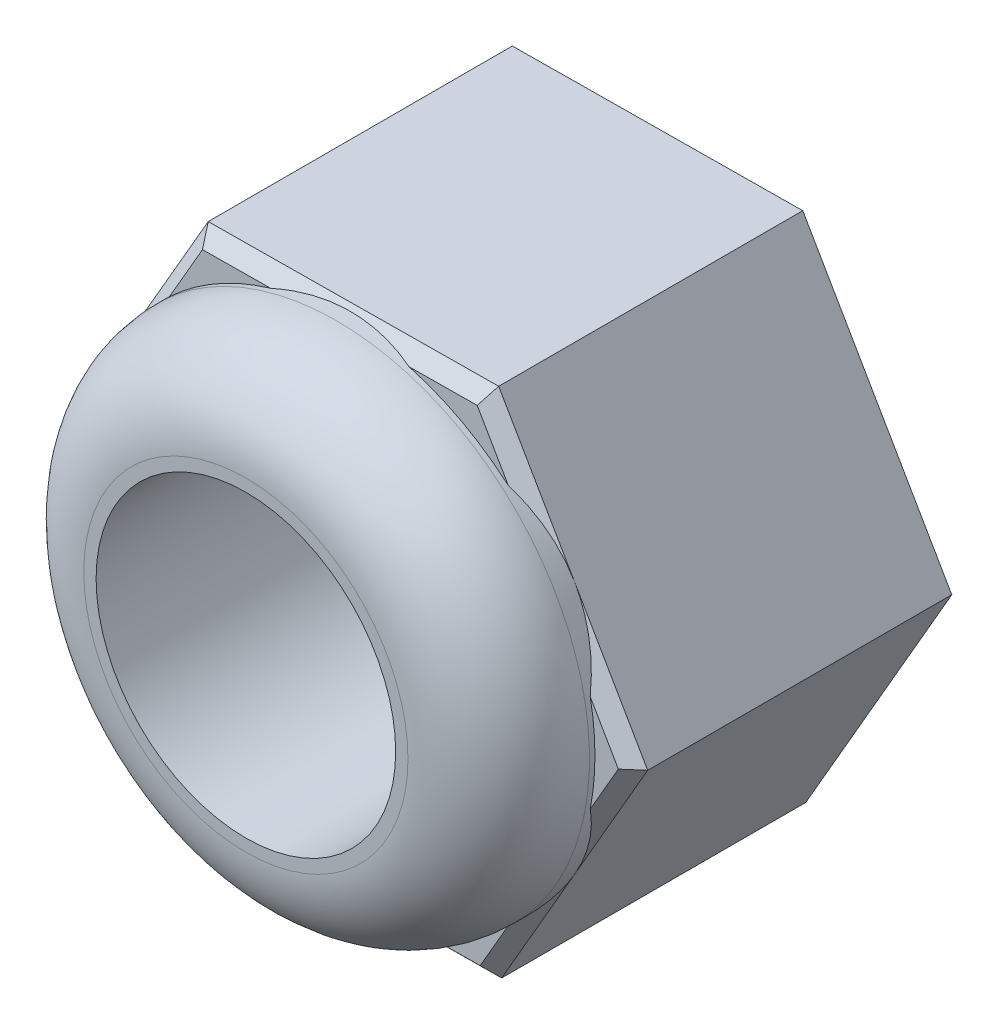
ISO-10303-21;
HEADER;
FILE_DESCRIPTION(('STEP AP214'),'2;1');
FILE_NAME('part.step','',(''),(''),'','','');
FILE_SCHEMA(('AUTOMOTIVE_DESIGN { 1 0 10303 214 1 1 1 1 }'));
ENDSEC;
DATA;
#1=APPLICATION_CONTEXT('core data for automotive mechanical design processes');
#2=APPLICATION_PROTOCOL_DEFINITION('international standard','automotive_design',2000,#1);
#3=PRODUCT_CONTEXT('',#1,'mechanical');
#4=PRODUCT('Part','Part','',(#3));
#5=PRODUCT_RELATED_PRODUCT_CATEGORY('part','',(#4));
#6=PRODUCT_DEFINITION_FORMATION('','',#4);
#7=PRODUCT_DEFINITION_CONTEXT('part definition',#1,'design');
#8=PRODUCT_DEFINITION('design','',#6,#7);
#9=PRODUCT_DEFINITION_SHAPE('','',#8);
#10=(LENGTH_UNIT() NAMED_UNIT(*) SI_UNIT(.MILLI.,.METRE.));
#11=(NAMED_UNIT(*) PLANE_ANGLE_UNIT() SI_UNIT($,.RADIAN.));
#12=(NAMED_UNIT(*) SI_UNIT($,.STERADIAN.) SOLID_ANGLE_UNIT());
#13=UNCERTAINTY_MEASURE_WITH_UNIT(LENGTH_MEASURE(1.E-05),#10,'distance_accuracy_value','');
#14=(GEOMETRIC_REPRESENTATION_CONTEXT(3) GLOBAL_UNCERTAINTY_ASSIGNED_CONTEXT((#13)) GLOBAL_UNIT_ASSIGNED_CONTEXT((#10,
#11,#12)) REPRESENTATION_CONTEXT('',''));
#15=CARTESIAN_POINT('',(0.,0.,0.));
#16=DIRECTION('',(0.,0.,1.));
#17=DIRECTION('',(1.,0.,0.));
#18=AXIS2_PLACEMENT_3D('',#15,#16,#17);
#19=CARTESIAN_POINT('',(12.8092435570243,13.3167483371117,8.89));
#20=DIRECTION('',(0.,0.,1.));
#21=DIRECTION('',(1.,0.,0.));
#22=AXIS2_PLACEMENT_3D('',#19,#20,#21);
#23=PLANE('',#22);
#24=CARTESIAN_POINT('',(12.8520866791741,13.2922264839932,8.89));
#25=DIRECTION('',(0.,0.,1.));
#26=DIRECTION('',(1.,0.,0.));
#27=AXIS2_PLACEMENT_3D('',#24,#25,#26);
#28=CIRCLE('',#27,7.07496029175945);
#29=CARTESIAN_POINT('',(5.96017341320023,11.6932910055368,8.89));
#30=VERTEX_POINT('',#29);
#31=CARTESIAN_POINT('',(5.96017341320023,14.8911619624497,8.89));
#32=VERTEX_POINT('',#31);
#33=EDGE_CURVE('E124',#30,#32,#28,.F.);
#34=ORIENTED_EDGE('',*,*,#33,.T.);
#35=DIRECTION('',(0.500000000000002,0.866025403784437,0.));
#36=VECTOR('',#35,1.);
#37=CARTESIAN_POINT('',(5.03702758429654,13.2922264839932,8.89));
#38=LINE('',#37,#36);
#39=CARTESIAN_POINT('',(5.03702758429655,13.2922264839932,8.88999999999999));
#40=VERTEX_POINT('',#39);
#41=EDGE_CURVE('E126',#40,#32,#38,.T.);
#42=ORIENTED_EDGE('',*,*,#41,.F.);
#43=DIRECTION('',(-0.500000000000003,0.866025403784437,0.));
#44=VECTOR('',#43,1.);
#45=CARTESIAN_POINT('',(5.9601734132002,11.6932910055368,8.89));
#46=LINE('',#45,#44);
#47=EDGE_CURVE('E128',#30,#40,#46,.T.);
#48=ORIENTED_EDGE('',*,*,#47,.F.);
#49=EDGE_LOOP('',(#34,#42,#48));
#50=FACE_BOUND('',#49,.T.);
#51=ADVANCED_FACE('F17',(#50),#23,.T.);
#52=CARTESIAN_POINT('',(12.8092435570243,13.3167483371117,8.89));
#53=DIRECTION('',(0.,0.,1.));
#54=DIRECTION('',(1.,0.,0.));
#55=AXIS2_PLACEMENT_3D('',#52,#53,#54);
#56=PLANE('',#55);
#57=CARTESIAN_POINT('',(12.8520866791741,13.2922264839932,8.89));
#58=DIRECTION('',(0.,0.,1.));
#59=DIRECTION('',(1.,0.,0.));
#60=AXIS2_PLACEMENT_3D('',#57,#58,#59);
#61=CIRCLE('',#60,7.07496029175945);
#62=CARTESIAN_POINT('',(8.02141130283164,8.1231222542091,8.89));
#63=VERTEX_POINT('',#62);
#64=CARTESIAN_POINT('',(10.7322456959346,6.54231260782032,8.89));
#65=VERTEX_POINT('',#64);
#66=EDGE_CURVE('E176',#63,#65,#61,.T.);
#67=ORIENTED_EDGE('',*,*,#66,.F.);
#68=DIRECTION('',(-0.500000000000001,0.866025403784438,0.));
#69=VECTOR('',#68,1.);
#70=CARTESIAN_POINT('',(8.94340854528067,6.52617618584898,8.89));
#71=LINE('',#70,#69);
#72=CARTESIAN_POINT('',(8.94340854528066,6.52617618584898,8.89));
#73=VERTEX_POINT('',#72);
#74=EDGE_CURVE('E341',#73,#63,#71,.T.);
#75=ORIENTED_EDGE('',*,*,#74,.F.);
#76=DIRECTION('',(-0.999959316681197,-0.00902025401375281,0.));
#77=VECTOR('',#76,1.);
#78=CARTESIAN_POINT('',(10.7322456959346,6.54231260782032,8.89));
#79=LINE('',#78,#77);
#80=EDGE_CURVE('E321',#65,#73,#79,.T.);
#81=ORIENTED_EDGE('',*,*,#80,.F.);
#82=EDGE_LOOP('',(#67,#75,#81));
#83=FACE_BOUND('',#82,.T.);
#84=ADVANCED_FACE('F606',(#83),#56,.T.);
#85=CARTESIAN_POINT('',(12.8092435570243,13.3167483371117,8.89));
#86=DIRECTION('',(0.,0.,1.));
#87=DIRECTION('',(1.,0.,0.));
#88=AXIS2_PLACEMENT_3D('',#85,#86,#87);
#89=PLANE('',#88);
#90=CARTESIAN_POINT('',(12.8520866791741,13.2922264839932,8.89));
#91=DIRECTION('',(0.,0.,1.));
#92=DIRECTION('',(1.,0.,0.));
#93=AXIS2_PLACEMENT_3D('',#90,#91,#92);
#94=CIRCLE('',#93,7.07496029175945);
#95=CARTESIAN_POINT('',(15.0933496221487,6.58165247349143,8.89));
#96=VERTEX_POINT('',#95);
#97=CARTESIAN_POINT('',(17.504023442271,7.96169672775696,8.89));
#98=VERTEX_POINT('',#97);
#99=EDGE_CURVE('E171',#96,#98,#94,.T.);
#100=ORIENTED_EDGE('',*,*,#99,.F.);
#101=DIRECTION('',(-0.999959316681198,-0.00902025401375211,0.));
#102=VECTOR('',#101,1.);
#103=CARTESIAN_POINT('',(16.7157038353579,6.59628711598069,8.89));
#104=LINE('',#103,#102);
#105=CARTESIAN_POINT('',(16.7157038353579,6.59628711598069,8.88999999999999));
#106=VERTEX_POINT('',#105);
#107=EDGE_CURVE('E323',#106,#96,#104,.T.);
#108=ORIENTED_EDGE('',*,*,#107,.F.);
#109=DIRECTION('',(-0.499999999999995,-0.866025403784442,0.));
#110=VECTOR('',#109,1.);
#111=CARTESIAN_POINT('',(17.504023442271,7.96169672775699,8.89));
#112=LINE('',#111,#110);
#113=EDGE_CURVE('E279',#98,#106,#112,.T.);
#114=ORIENTED_EDGE('',*,*,#113,.F.);
#115=EDGE_LOOP('',(#100,#108,#114));
#116=FACE_BOUND('',#115,.T.);
#117=ADVANCED_FACE('F597',(#116),#89,.T.);
#118=CARTESIAN_POINT('',(12.8092435570243,13.3167483371117,8.89));
#119=DIRECTION('',(0.,0.,1.));
#120=DIRECTION('',(1.,0.,0.));
#121=AXIS2_PLACEMENT_3D('',#118,#119,#120);
#122=PLANE('',#121);
#123=CARTESIAN_POINT('',(12.8520866791741,13.2922264839932,8.89));
#124=DIRECTION('',(0.,0.,1.));
#125=DIRECTION('',(1.,0.,0.));
#126=AXIS2_PLACEMENT_3D('',#123,#124,#125);
#127=CIRCLE('',#126,7.07496029175945);
#128=CARTESIAN_POINT('',(19.794429245252,11.9287959484706,8.89));
#129=VERTEX_POINT('',#128);
#130=CARTESIAN_POINT('',(19.7944292452516,14.6556570195177,8.89));
#131=VERTEX_POINT('',#130);
#132=EDGE_CURVE('E164',#129,#131,#127,.T.);
#133=ORIENTED_EDGE('',*,*,#132,.F.);
#134=DIRECTION('',(-0.500000000000002,-0.866025403784437,0.));
#135=VECTOR('',#134,1.);
#136=CARTESIAN_POINT('',(20.5816062319577,13.2922264839938,8.88999999999999));
#137=LINE('',#136,#135);
#138=CARTESIAN_POINT('',(20.5816062319577,13.2922264839938,8.88999999999999));
#139=VERTEX_POINT('',#138);
#140=EDGE_CURVE('E303',#139,#129,#137,.T.);
#141=ORIENTED_EDGE('',*,*,#140,.F.);
#142=DIRECTION('',(0.500000000000001,-0.866025403784438,0.));
#143=VECTOR('',#142,1.);
#144=CARTESIAN_POINT('',(19.7944292452516,14.6556570195177,8.88999999999999));
#145=LINE('',#144,#143);
#146=EDGE_CURVE('E244',#131,#139,#145,.T.);
#147=ORIENTED_EDGE('',*,*,#146,.F.);
#148=EDGE_LOOP('',(#133,#141,#147));
#149=FACE_BOUND('',#148,.T.);
#150=ADVANCED_FACE('F588',(#149),#122,.T.);
#151=CARTESIAN_POINT('',(12.8092435570243,13.3167483371117,8.89));
#152=DIRECTION('',(0.,0.,1.));
#153=DIRECTION('',(1.,0.,0.));
#154=AXIS2_PLACEMENT_3D('',#151,#152,#153);
#155=PLANE('',#154);
#156=DIRECTION('',(0.999959316681197,0.00902025401375508,0.));
#157=VECTOR('',#156,1.);
#158=CARTESIAN_POINT('',(14.7264224958761,20.1143909774807,8.89000000000001));
#159=LINE('',#158,#157);
#160=CARTESIAN_POINT('',(14.726422495876,20.1143909774807,8.89));
#161=VERTEX_POINT('',#160);
#162=CARTESIAN_POINT('',(16.6328986866783,20.1315885766483,8.89));
#163=VERTEX_POINT('',#162);
#164=EDGE_CURVE('E179',#161,#163,#159,.T.);
#165=ORIENTED_EDGE('',*,*,#164,.F.);
#166=CARTESIAN_POINT('',(12.8520866791741,13.2922264839932,8.89));
#167=DIRECTION('',(0.,0.,1.));
#168=DIRECTION('',(1.,0.,0.));
#169=AXIS2_PLACEMENT_3D('',#166,#167,#168);
#170=CIRCLE('',#169,7.07496029175945);
#171=CARTESIAN_POINT('',(17.5040234422724,18.6227562402282,8.89));
#172=VERTEX_POINT('',#171);
#173=EDGE_CURVE('E157',#172,#161,#170,.T.);
#174=ORIENTED_EDGE('',*,*,#173,.F.);
#175=DIRECTION('',(0.500000000000002,-0.866025403784437,0.));
#176=VECTOR('',#175,1.);
#177=CARTESIAN_POINT('',(16.6328986866783,20.1315885766483,8.89));
#178=LINE('',#177,#176);
#179=EDGE_CURVE('E247',#163,#172,#178,.T.);
#180=ORIENTED_EDGE('',*,*,#179,.F.);
#181=EDGE_LOOP('',(#165,#174,#180));
#182=FACE_BOUND('',#181,.T.);
#183=ADVANCED_FACE('F579',(#182),#155,.T.);
#184=CARTESIAN_POINT('',(12.8092435570243,13.3167483371117,8.89));
#185=DIRECTION('',(0.,0.,1.));
#186=DIRECTION('',(1.,0.,0.));
#187=AXIS2_PLACEMENT_3D('',#184,#185,#186);
#188=PLANE('',#187);
#189=CARTESIAN_POINT('',(12.8520866791741,13.2922264839932,8.89));
#190=DIRECTION('',(0.,0.,1.));
#191=DIRECTION('',(1.,0.,0.));
#192=AXIS2_PLACEMENT_3D('',#189,#190,#191);
#193=CIRCLE('',#192,7.07496029175945);
#194=CARTESIAN_POINT('',(10.8549855668764,20.0794682122089,8.89));
#195=VERTEX_POINT('',#194);
#196=CARTESIAN_POINT('',(8.02141130283161,18.4613307137773,8.89));
#197=VERTEX_POINT('',#196);
#198=EDGE_CURVE('E146',#195,#197,#193,.T.);
#199=ORIENTED_EDGE('',*,*,#198,.F.);
#200=DIRECTION('',(0.999959316681198,0.00902025401375156,0.));
#201=VECTOR('',#200,1.);
#202=CARTESIAN_POINT('',(8.94569975194277,20.0622452684868,8.89));
#203=LINE('',#202,#201);
#204=CARTESIAN_POINT('',(8.94569975194277,20.0622452684868,8.89));
#205=VERTEX_POINT('',#204);
#206=EDGE_CURVE('E237',#205,#195,#203,.T.);
#207=ORIENTED_EDGE('',*,*,#206,.F.);
#208=DIRECTION('',(0.500000000000003,0.866025403784437,0.));
#209=VECTOR('',#208,1.);
#210=CARTESIAN_POINT('',(8.02141130283165,18.4613307137774,8.89));
#211=LINE('',#210,#209);
#212=EDGE_CURVE('E141',#197,#205,#211,.T.);
#213=ORIENTED_EDGE('',*,*,#212,.F.);
#214=EDGE_LOOP('',(#199,#207,#213));
#215=FACE_BOUND('',#214,.T.);
#216=ADVANCED_FACE('F571',(#215),#188,.T.);
#217=CARTESIAN_POINT('',(5.79389326526339,14.984156297933,8.6995));
#218=DIRECTION('',(-0.612372435695794,0.353553390593273,0.707106781186548));
#219=DIRECTION('',(0.755928946018455,0.,0.654653670707977));
#220=AXIS2_PLACEMENT_3D('',#217,#218,#219);
#221=PLANE('',#220);
#222=DIRECTION('',(0.380489956884651,-0.652216773658183,0.65562235537604));
#223=VECTOR('',#222,1.);
#224=CARTESIAN_POINT('',(8.72458667917406,20.4412661922338,8.509));
#225=LINE('',#224,#223);
#226=CARTESIAN_POINT('',(8.72458667917407,20.4412661922338,8.509));
#227=VERTEX_POINT('',#226);
#228=EDGE_CURVE('E241',#227,#205,#225,.T.);
#229=ORIENTED_EDGE('',*,*,#228,.F.);
#230=DIRECTION('',(-0.5,-0.866025403784439,0.));
#231=VECTOR('',#230,1.);
#232=CARTESIAN_POINT('',(4.59708667917407,13.2922264839932,8.509));
#233=LINE('',#232,#231);
#234=CARTESIAN_POINT('',(4.59708667917407,13.2922264839932,8.50900000000001));
#235=VERTEX_POINT('',#234);
#236=EDGE_CURVE('E148',#235,#227,#233,.F.);
#237=ORIENTED_EDGE('',*,*,#236,.F.);
#238=DIRECTION('',(0.755928946018454,0.,0.654653670707978));
#239=VECTOR('',#238,1.);
#240=CARTESIAN_POINT('',(6.54846733725178,13.2922264839932,10.1989452223489));
#241=LINE('',#240,#239);
#242=EDGE_CURVE('E140',#40,#235,#241,.F.);
#243=ORIENTED_EDGE('',*,*,#242,.F.);
#244=ORIENTED_EDGE('',*,*,#41,.T.);
#245=CARTESIAN_POINT('',(12.8520866791741,13.2922264839932,15.6580397082405));
#246=DIRECTION('',(-0.612372435695794,0.353553390593273,0.707106781186548));
#247=DIRECTION('',(0.612372435695795,-0.353553390593274,0.707106781186547));
#248=AXIS2_PLACEMENT_3D('',#245,#246,#247);
#249=ELLIPSE('',#248,10.0055047978573,7.07496029175945);
#250=EDGE_CURVE('E138',#197,#32,#249,.T.);
#251=ORIENTED_EDGE('',*,*,#250,.F.);
#252=ORIENTED_EDGE('',*,*,#212,.T.);
#253=EDGE_LOOP('',(#229,#237,#243,#244,#251,#252));
#254=FACE_BOUND('',#253,.T.);
#255=ADVANCED_FACE('F137',(#254),#221,.T.);
#256=CARTESIAN_POINT('',(7.84702499138914,8.04416820577205,8.6995));
#257=DIRECTION('',(-0.612372435695795,-0.353553390593274,0.707106781186547));
#258=DIRECTION('',(0.755928946018454,0.,0.654653670707978));
#259=AXIS2_PLACEMENT_3D('',#256,#257,#258);
#260=PLANE('',#259);
#261=ORIENTED_EDGE('',*,*,#242,.T.);
#262=DIRECTION('',(0.5,-0.866025403784439,0.));
#263=VECTOR('',#262,1.);
#264=CARTESIAN_POINT('',(8.72458667917406,6.14318677575268,8.509));
#265=LINE('',#264,#263);
#266=CARTESIAN_POINT('',(8.72458667917406,6.14318677575267,8.50900000000001));
#267=VERTEX_POINT('',#266);
#268=EDGE_CURVE('E150',#267,#235,#265,.F.);
#269=ORIENTED_EDGE('',*,*,#268,.F.);
#270=DIRECTION('',(-0.375428319403114,-0.657087306401108,-0.653674115103765));
#271=VECTOR('',#270,1.);
#272=CARTESIAN_POINT('',(8.94340854528066,6.52617618584898,8.89));
#273=LINE('',#272,#271);
#274=EDGE_CURVE('E318',#73,#267,#273,.T.);
#275=ORIENTED_EDGE('',*,*,#274,.F.);
#276=ORIENTED_EDGE('',*,*,#74,.T.);
#277=CARTESIAN_POINT('',(12.8520866791741,13.2922264839932,15.6580397082406));
#278=DIRECTION('',(-0.612372435695795,-0.353553390593274,0.707106781186547));
#279=DIRECTION('',(0.612372435695794,0.353553390593273,0.707106781186548));
#280=AXIS2_PLACEMENT_3D('',#277,#278,#279);
#281=ELLIPSE('',#280,10.0055047978573,7.07496029175945);
#282=EDGE_CURVE('E178',#30,#63,#281,.T.);
#283=ORIENTED_EDGE('',*,*,#282,.F.);
#284=ORIENTED_EDGE('',*,*,#47,.T.);
#285=EDGE_LOOP('',(#261,#269,#275,#276,#283,#284));
#286=FACE_BOUND('',#285,.T.);
#287=ADVANCED_FACE('F415',(#286),#260,.T.);
#288=CARTESIAN_POINT('',(14.9034980576467,6.38943214399377,8.6995));
#289=DIRECTION('',(0.006378282781149,-0.707078013735941,0.707106781186548));
#290=DIRECTION('',(0.,-0.707121165058142,-0.707092397022352));
#291=AXIS2_PLACEMENT_3D('',#288,#289,#290);
#292=PLANE('',#291);
#293=ORIENTED_EDGE('',*,*,#274,.T.);
#294=DIRECTION('',(0.999959316681198,0.009020254013752,0.));
#295=VECTOR('',#294,1.);
#296=CARTESIAN_POINT('',(16.9368169081266,6.21726619223375,8.509));
#297=LINE('',#296,#295);
#298=CARTESIAN_POINT('',(16.9368169081266,6.21726619223376,8.509));
#299=VERTEX_POINT('',#298);
#300=EDGE_CURVE('E306',#299,#267,#297,.F.);
#301=ORIENTED_EDGE('',*,*,#300,.F.);
#302=DIRECTION('',(0.380489956884648,-0.652216773658182,-0.655622355376043));
#303=VECTOR('',#302,1.);
#304=CARTESIAN_POINT('',(16.7157038353579,6.59628711598069,8.88999999999999));
#305=LINE('',#304,#303);
#306=EDGE_CURVE('E295',#106,#299,#305,.T.);
#307=ORIENTED_EDGE('',*,*,#306,.F.);
#308=ORIENTED_EDGE('',*,*,#107,.T.);
#309=CARTESIAN_POINT('',(12.8520866791741,13.2922264839932,15.6205177631372));
#310=DIRECTION('',(0.006378282781149,-0.707078013735941,0.707106781186548));
#311=DIRECTION('',(-0.006378282781149,0.707078013735941,0.707106781186547));
#312=AXIS2_PLACEMENT_3D('',#309,#310,#311);
#313=ELLIPSE('',#312,10.0055047978573,7.07496029175945);
#314=EDGE_CURVE('E173',#65,#96,#313,.T.);
#315=ORIENTED_EDGE('',*,*,#314,.F.);
#316=ORIENTED_EDGE('',*,*,#80,.T.);
#317=EDGE_LOOP('',(#293,#301,#307,#308,#315,#316));
#318=FACE_BOUND('',#317,.T.);
#319=ADVANCED_FACE('F548',(#318),#292,.T.);
#320=CARTESIAN_POINT('',(19.8353404870892,11.6186562979335,8.6995));
#321=DIRECTION('',(0.612372435695793,-0.353553390593273,0.707106781186549));
#322=DIRECTION('',(0.755928946018456,0.,-0.654653670707976));
#323=AXIS2_PLACEMENT_3D('',#320,#321,#322);
#324=PLANE('',#323);
#325=DIRECTION('',(0.755928946018455,0.,-0.654653670707977));
#326=VECTOR('',#325,1.);
#327=CARTESIAN_POINT('',(19.0519951054039,13.2922264839938,10.2146820935069));
#328=LINE('',#327,#326);
#329=CARTESIAN_POINT('',(21.0215471370802,13.2922264839938,8.509));
#330=VERTEX_POINT('',#329);
#331=EDGE_CURVE('E246',#139,#330,#328,.T.);
#332=ORIENTED_EDGE('',*,*,#331,.F.);
#333=ORIENTED_EDGE('',*,*,#140,.T.);
#334=CARTESIAN_POINT('',(12.8520866791741,13.2922264839932,15.5839602917588));
#335=DIRECTION('',(0.612372435695793,-0.353553390593273,0.707106781186549));
#336=DIRECTION('',(-0.612372435695796,0.353553390593275,0.707106781186546));
#337=AXIS2_PLACEMENT_3D('',#334,#335,#336);
#338=ELLIPSE('',#337,10.0055047978573,7.07496029175945);
#339=CARTESIAN_POINT('',(18.9791820226037,9.75474633811364,8.50899999999969));
#340=VERTEX_POINT('',#339);
#341=EDGE_CURVE('E166',#340,#129,#338,.T.);
#342=ORIENTED_EDGE('',*,*,#341,.F.);
#343=DIRECTION('',(0.5,0.866025403784439,0.));
#344=VECTOR('',#343,1.);
#345=CARTESIAN_POINT('',(21.0215471370802,13.2922264839938,8.509));
#346=LINE('',#345,#344);
#347=EDGE_CURVE('E266',#330,#340,#346,.F.);
#348=ORIENTED_EDGE('',*,*,#347,.F.);
#349=EDGE_LOOP('',(#332,#333,#342,#348));
#350=FACE_BOUND('',#349,.T.);
#351=ADVANCED_FACE('F539',(#350),#324,.T.);
#352=CARTESIAN_POINT('',(19.8353404870892,11.6186562979335,8.6995));
#353=DIRECTION('',(0.612372435695793,-0.353553390593273,0.707106781186549));
#354=DIRECTION('',(0.755928946018456,0.,-0.654653670707976));
#355=AXIS2_PLACEMENT_3D('',#352,#353,#354);
#356=PLANE('',#355);
#357=CARTESIAN_POINT('',(12.8520866791741,13.2922264839932,15.5839602917588));
#358=DIRECTION('',(0.612372435695793,-0.353553390593273,0.707106781186549));
#359=DIRECTION('',(-0.612372435695796,0.353553390593275,0.707106781186546));
#360=AXIS2_PLACEMENT_3D('',#357,#358,#359);
#361=ELLIPSE('',#360,10.0055047978573,7.07496029175945);
#362=EDGE_CURVE('E169',#98,#340,#361,.T.);
#363=ORIENTED_EDGE('',*,*,#362,.F.);
#364=ORIENTED_EDGE('',*,*,#113,.T.);
#365=ORIENTED_EDGE('',*,*,#306,.T.);
#366=DIRECTION('',(0.5,0.866025403784439,0.));
#367=VECTOR('',#366,1.);
#368=CARTESIAN_POINT('',(21.0215471370802,13.2922264839938,8.509));
#369=LINE('',#368,#367);
#370=EDGE_CURVE('E269',#340,#299,#369,.F.);
#371=ORIENTED_EDGE('',*,*,#370,.F.);
#372=EDGE_LOOP('',(#363,#364,#365,#371));
#373=FACE_BOUND('',#372,.T.);
#374=ADVANCED_FACE('F531',(#373),#356,.T.);
#375=CARTESIAN_POINT('',(17.7398089210676,18.595363811268,8.6995));
#376=DIRECTION('',(0.612372435695794,0.353553390593273,0.707106781186548));
#377=DIRECTION('',(0.755928946018455,0.,-0.654653670707977));
#378=AXIS2_PLACEMENT_3D('',#375,#376,#377);
#379=PLANE('',#378);
#380=CARTESIAN_POINT('',(12.8520866791741,13.2922264839932,15.5839602917594));
#381=DIRECTION('',(0.612372435695794,0.353553390593273,0.707106781186548));
#382=DIRECTION('',(-0.612372435695795,-0.353553390593274,0.707106781186547));
#383=AXIS2_PLACEMENT_3D('',#380,#381,#382);
#384=ELLIPSE('',#383,10.0055047978573,7.07496029175945);
#385=CARTESIAN_POINT('',(18.9791820226039,16.8297066298729,8.509));
#386=VERTEX_POINT('',#385);
#387=EDGE_CURVE('E159',#386,#172,#384,.T.);
#388=ORIENTED_EDGE('',*,*,#387,.F.);
#389=DIRECTION('',(-0.5,0.866025403784439,0.));
#390=VECTOR('',#389,1.);
#391=CARTESIAN_POINT('',(16.8517205527849,20.5145779867446,8.509));
#392=LINE('',#391,#390);
#393=CARTESIAN_POINT('',(16.8517205527849,20.5145779867446,8.509));
#394=VERTEX_POINT('',#393);
#395=EDGE_CURVE('E250',#394,#386,#392,.F.);
#396=ORIENTED_EDGE('',*,*,#395,.F.);
#397=DIRECTION('',(0.375428319403145,0.657087306401093,-0.653674115103762));
#398=VECTOR('',#397,1.);
#399=CARTESIAN_POINT('',(16.6328986866783,20.1315885766483,8.89));
#400=LINE('',#399,#398);
#401=EDGE_CURVE('E263',#163,#394,#400,.T.);
#402=ORIENTED_EDGE('',*,*,#401,.F.);
#403=ORIENTED_EDGE('',*,*,#179,.T.);
#404=EDGE_LOOP('',(#388,#396,#402,#403));
#405=FACE_BOUND('',#404,.T.);
#406=ADVANCED_FACE('F379',(#405),#379,.T.);
#407=CARTESIAN_POINT('',(17.7398089210676,18.595363811268,8.6995));
#408=DIRECTION('',(0.612372435695794,0.353553390593273,0.707106781186548));
#409=DIRECTION('',(0.755928946018455,0.,-0.654653670707977));
#410=AXIS2_PLACEMENT_3D('',#407,#408,#409);
#411=PLANE('',#410);
#412=ORIENTED_EDGE('',*,*,#331,.T.);
#413=DIRECTION('',(-0.5,0.866025403784439,0.));
#414=VECTOR('',#413,1.);
#415=CARTESIAN_POINT('',(16.8517205527849,20.5145779867446,8.509));
#416=LINE('',#415,#414);
#417=EDGE_CURVE('E253',#386,#330,#416,.F.);
#418=ORIENTED_EDGE('',*,*,#417,.F.);
#419=CARTESIAN_POINT('',(12.8520866791741,13.2922264839932,15.5839602917594));
#420=DIRECTION('',(0.612372435695794,0.353553390593273,0.707106781186548));
#421=DIRECTION('',(-0.612372435695795,-0.353553390593274,0.707106781186547));
#422=AXIS2_PLACEMENT_3D('',#419,#420,#421);
#423=ELLIPSE('',#422,10.0055047978573,7.07496029175945);
#424=EDGE_CURVE('E162',#131,#386,#423,.T.);
#425=ORIENTED_EDGE('',*,*,#424,.F.);
#426=ORIENTED_EDGE('',*,*,#146,.T.);
#427=EDGE_LOOP('',(#412,#418,#425,#426));
#428=FACE_BOUND('',#427,.T.);
#429=ADVANCED_FACE('F515',(#428),#411,.T.);
#430=CARTESIAN_POINT('',(10.7363361293377,20.2689056710882,8.6995));
#431=DIRECTION('',(-0.006378282781149,0.707078013735944,0.707106781186545));
#432=DIRECTION('',(0.,-0.707121165058139,0.707092397022355));
#433=AXIS2_PLACEMENT_3D('',#430,#431,#432);
#434=PLANE('',#433);
#435=CARTESIAN_POINT('',(12.8520866791741,13.2922264839932,15.6949799600208));
#436=DIRECTION('',(-0.006378282781149,0.707078013735944,0.707106781186545));
#437=DIRECTION('',(0.00637828278114895,-0.707078013735938,0.70710678118655));
#438=AXIS2_PLACEMENT_3D('',#435,#436,#437);
#439=ELLIPSE('',#438,10.0055047978574,7.07496029175945);
#440=EDGE_CURVE('E152',#161,#195,#439,.T.);
#441=ORIENTED_EDGE('',*,*,#440,.F.);
#442=ORIENTED_EDGE('',*,*,#164,.T.);
#443=ORIENTED_EDGE('',*,*,#401,.T.);
#444=DIRECTION('',(-0.999959316681198,-0.009020254013752,0.));
#445=VECTOR('',#444,1.);
#446=CARTESIAN_POINT('',(8.72458667917406,20.4412661922338,8.509));
#447=LINE('',#446,#445);
#448=EDGE_CURVE('E275',#227,#394,#447,.F.);
#449=ORIENTED_EDGE('',*,*,#448,.F.);
#450=ORIENTED_EDGE('',*,*,#228,.T.);
#451=ORIENTED_EDGE('',*,*,#206,.T.);
#452=EDGE_LOOP('',(#441,#442,#443,#449,#450,#451));
#453=FACE_BOUND('',#452,.T.);
#454=ADVANCED_FACE('F373',(#453),#434,.T.);
#455=CARTESIAN_POINT('',(12.8520866791741,13.2922264839932,8.89));
#456=DIRECTION('',(0.,0.,1.));
#457=DIRECTION('',(1.,0.,0.));
#458=AXIS2_PLACEMENT_3D('',#455,#456,#457);
#459=CYLINDRICAL_SURFACE('',#458,7.07496029175945);
#460=CARTESIAN_POINT('',(12.8520866791741,13.2922264839932,9.0424));
#461=DIRECTION('',(0.,0.,-1.));
#462=DIRECTION('',(-1.,0.,0.));
#463=AXIS2_PLACEMENT_3D('',#460,#461,#462);
#464=CIRCLE('',#463,7.07496029175945);
#465=CARTESIAN_POINT('',(5.77712638741462,13.2922264839932,9.0424));
#466=VERTEX_POINT('',#465);
#467=EDGE_CURVE('E213',#466,#466,#464,.F.);
#468=ORIENTED_EDGE('',*,*,#467,.F.);
#469=EDGE_LOOP('',(#468));
#470=FACE_BOUND('',#469,.T.);
#471=ORIENTED_EDGE('',*,*,#250,.T.);
#472=ORIENTED_EDGE('',*,*,#33,.F.);
#473=ORIENTED_EDGE('',*,*,#282,.T.);
#474=ORIENTED_EDGE('',*,*,#66,.T.);
#475=ORIENTED_EDGE('',*,*,#314,.T.);
#476=ORIENTED_EDGE('',*,*,#99,.T.);
#477=ORIENTED_EDGE('',*,*,#362,.T.);
#478=ORIENTED_EDGE('',*,*,#341,.T.);
#479=ORIENTED_EDGE('',*,*,#132,.T.);
#480=ORIENTED_EDGE('',*,*,#424,.T.);
#481=ORIENTED_EDGE('',*,*,#387,.T.);
#482=ORIENTED_EDGE('',*,*,#173,.T.);
#483=ORIENTED_EDGE('',*,*,#440,.T.);
#484=ORIENTED_EDGE('',*,*,#198,.T.);
#485=EDGE_LOOP('',(#471,#472,#473,#474,#475,#476,#477,#478,#479,#480,#481,#482,#483,#484));
#486=FACE_BOUND('',#485,.T.);
#487=ADVANCED_FACE('F143',(#470,#486),#459,.T.);
#488=CARTESIAN_POINT('',(4.59708667917407,13.2922264839932,0.));
#489=DIRECTION('',(-0.866025403784439,0.5,0.));
#490=DIRECTION('',(-0.5,-0.866025403784439,0.));
#491=AXIS2_PLACEMENT_3D('',#488,#489,#490);
#492=PLANE('',#491);
#493=DIRECTION('',(-0.5,-0.866025403784439,0.));
#494=VECTOR('',#493,1.);
#495=CARTESIAN_POINT('',(8.72458667917406,20.4412661922338,0.));
#496=LINE('',#495,#494);
#497=CARTESIAN_POINT('',(8.72458667917407,20.4412661922338,0.));
#498=VERTEX_POINT('',#497);
#499=CARTESIAN_POINT('',(4.59708667917407,13.2922264839932,0.));
#500=VERTEX_POINT('',#499);
#501=EDGE_CURVE('E210',#498,#500,#496,.T.);
#502=ORIENTED_EDGE('',*,*,#501,.T.);
#503=DIRECTION('',(0.,0.,1.));
#504=VECTOR('',#503,1.);
#505=CARTESIAN_POINT('',(4.59708667917407,13.2922264839932,0.));
#506=LINE('',#505,#504);
#507=EDGE_CURVE('E309',#235,#500,#506,.F.);
#508=ORIENTED_EDGE('',*,*,#507,.F.);
#509=ORIENTED_EDGE('',*,*,#236,.T.);
#510=DIRECTION('',(0.,0.,1.));
#511=VECTOR('',#510,1.);
#512=CARTESIAN_POINT('',(8.72458667917406,20.4412661922338,0.));
#513=LINE('',#512,#511);
#514=EDGE_CURVE('E234',#498,#227,#513,.T.);
#515=ORIENTED_EDGE('',*,*,#514,.F.);
#516=EDGE_LOOP('',(#502,#508,#509,#515));
#517=FACE_BOUND('',#516,.T.);
#518=ADVANCED_FACE('F392',(#517),#492,.T.);
#519=CARTESIAN_POINT('',(8.72458667917406,6.14318677575268,0.));
#520=DIRECTION('',(-0.866025403784439,-0.5,0.));
#521=DIRECTION('',(0.5,-0.866025403784439,0.));
#522=AXIS2_PLACEMENT_3D('',#519,#520,#521);
#523=PLANE('',#522);
#524=DIRECTION('',(0.500000000000001,-0.866025403784438,0.));
#525=VECTOR('',#524,1.);
#526=CARTESIAN_POINT('',(4.59708667917406,13.2922264839932,0.));
#527=LINE('',#526,#525);
#528=CARTESIAN_POINT('',(8.72458667917407,6.14318677575267,0.));
#529=VERTEX_POINT('',#528);
#530=EDGE_CURVE('E207',#500,#529,#527,.T.);
#531=ORIENTED_EDGE('',*,*,#530,.T.);
#532=DIRECTION('',(0.,0.,1.));
#533=VECTOR('',#532,1.);
#534=CARTESIAN_POINT('',(8.72458667917406,6.14318677575267,0.));
#535=LINE('',#534,#533);
#536=EDGE_CURVE('E270',#267,#529,#535,.F.);
#537=ORIENTED_EDGE('',*,*,#536,.F.);
#538=ORIENTED_EDGE('',*,*,#268,.T.);
#539=ORIENTED_EDGE('',*,*,#507,.T.);
#540=EDGE_LOOP('',(#531,#537,#538,#539));
#541=FACE_BOUND('',#540,.T.);
#542=ADVANCED_FACE('F416',(#541),#523,.T.);
#543=CARTESIAN_POINT('',(16.9368169081266,6.21726619223375,0.));
#544=DIRECTION('',(0.009020254013752,-0.999959316681198,0.));
#545=DIRECTION('',(0.999959316681198,0.009020254013752,0.));
#546=AXIS2_PLACEMENT_3D('',#543,#544,#545);
#547=PLANE('',#546);
#548=DIRECTION('',(0.999959316681197,0.00902025401375164,0.));
#549=VECTOR('',#548,1.);
#550=CARTESIAN_POINT('',(8.72458667917406,6.14318677575268,0.));
#551=LINE('',#550,#549);
#552=CARTESIAN_POINT('',(16.9368169081266,6.21726619223376,0.));
#553=VERTEX_POINT('',#552);
#554=EDGE_CURVE('E204',#529,#553,#551,.T.);
#555=ORIENTED_EDGE('',*,*,#554,.T.);
#556=DIRECTION('',(0.,0.,1.));
#557=VECTOR('',#556,1.);
#558=CARTESIAN_POINT('',(16.9368169081266,6.21726619223376,0.));
#559=LINE('',#558,#557);
#560=EDGE_CURVE('E254',#299,#553,#559,.F.);
#561=ORIENTED_EDGE('',*,*,#560,.F.);
#562=ORIENTED_EDGE('',*,*,#300,.T.);
#563=ORIENTED_EDGE('',*,*,#536,.T.);
#564=EDGE_LOOP('',(#555,#561,#562,#563));
#565=FACE_BOUND('',#564,.T.);
#566=ADVANCED_FACE('F408',(#565),#547,.T.);
#567=CARTESIAN_POINT('',(21.0215471370802,13.2922264839938,0.));
#568=DIRECTION('',(0.866025403784439,-0.5,0.));
#569=DIRECTION('',(0.5,0.866025403784439,0.));
#570=AXIS2_PLACEMENT_3D('',#567,#568,#569);
#571=PLANE('',#570);
#572=DIRECTION('',(0.499999999999998,0.86602540378444,0.));
#573=VECTOR('',#572,1.);
#574=CARTESIAN_POINT('',(16.9368169081266,6.21726619223375,0.));
#575=LINE('',#574,#573);
#576=CARTESIAN_POINT('',(21.0215471370802,13.2922264839938,0.));
#577=VERTEX_POINT('',#576);
#578=EDGE_CURVE('E194',#553,#577,#575,.T.);
#579=ORIENTED_EDGE('',*,*,#578,.T.);
#580=DIRECTION('',(0.,0.,1.));
#581=VECTOR('',#580,1.);
#582=CARTESIAN_POINT('',(21.0215471370802,13.2922264839938,0.));
#583=LINE('',#582,#581);
#584=EDGE_CURVE('E259',#330,#577,#583,.F.);
#585=ORIENTED_EDGE('',*,*,#584,.F.);
#586=ORIENTED_EDGE('',*,*,#347,.T.);
#587=ORIENTED_EDGE('',*,*,#370,.T.);
#588=ORIENTED_EDGE('',*,*,#560,.T.);
#589=EDGE_LOOP('',(#579,#585,#586,#587,#588));
#590=FACE_BOUND('',#589,.T.);
#591=ADVANCED_FACE('F405',(#590),#571,.T.);
#592=CARTESIAN_POINT('',(16.8517205527849,20.5145779867446,0.));
#593=DIRECTION('',(0.866025403784439,0.5,0.));
#594=DIRECTION('',(-0.5,0.866025403784439,0.));
#595=AXIS2_PLACEMENT_3D('',#592,#593,#594);
#596=PLANE('',#595);
#597=DIRECTION('',(-0.499999999999998,0.86602540378444,0.));
#598=VECTOR('',#597,1.);
#599=CARTESIAN_POINT('',(21.0215471370802,13.2922264839938,0.));
#600=LINE('',#599,#598);
#601=CARTESIAN_POINT('',(16.8517205527849,20.5145779867446,0.));
#602=VERTEX_POINT('',#601);
#603=EDGE_CURVE('E187',#577,#602,#600,.T.);
#604=ORIENTED_EDGE('',*,*,#603,.T.);
#605=DIRECTION('',(0.,0.,1.));
#606=VECTOR('',#605,1.);
#607=CARTESIAN_POINT('',(16.8517205527849,20.5145779867446,0.));
#608=LINE('',#607,#606);
#609=EDGE_CURVE('E284',#394,#602,#608,.F.);
#610=ORIENTED_EDGE('',*,*,#609,.F.);
#611=ORIENTED_EDGE('',*,*,#395,.T.);
#612=ORIENTED_EDGE('',*,*,#417,.T.);
#613=ORIENTED_EDGE('',*,*,#584,.T.);
#614=EDGE_LOOP('',(#604,#610,#611,#612,#613));
#615=FACE_BOUND('',#614,.T.);
#616=ADVANCED_FACE('F382',(#615),#596,.T.);
#617=CARTESIAN_POINT('',(8.72458667917406,20.4412661922338,0.));
#618=DIRECTION('',(-0.009020254013752,0.999959316681198,0.));
#619=DIRECTION('',(-0.999959316681198,-0.009020254013752,0.));
#620=AXIS2_PLACEMENT_3D('',#617,#618,#619);
#621=PLANE('',#620);
#622=DIRECTION('',(-0.999959316681197,-0.00902025401375449,0.));
#623=VECTOR('',#622,1.);
#624=CARTESIAN_POINT('',(16.8517205527849,20.5145779867446,0.));
#625=LINE('',#624,#623);
#626=EDGE_CURVE('E185',#602,#498,#625,.T.);
#627=ORIENTED_EDGE('',*,*,#626,.T.);
#628=ORIENTED_EDGE('',*,*,#514,.T.);
#629=ORIENTED_EDGE('',*,*,#448,.T.);
#630=ORIENTED_EDGE('',*,*,#609,.T.);
#631=EDGE_LOOP('',(#627,#628,#629,#630));
#632=FACE_BOUND('',#631,.T.);
#633=ADVANCED_FACE('F221',(#632),#621,.T.);
#634=CARTESIAN_POINT('',(12.8520866791741,13.2922264839932,9.0424));
#635=DIRECTION('',(0.,0.,-1.));
#636=DIRECTION('',(-1.,0.,0.));
#637=AXIS2_PLACEMENT_3D('',#634,#635,#636);
#638=TOROIDAL_SURFACE('',#637,4.53496029175945,2.54);
#639=CARTESIAN_POINT('',(12.8520866791741,13.2922264839932,11.5824));
#640=DIRECTION('',(0.,0.,-1.));
#641=DIRECTION('',(1.,0.,0.));
#642=AXIS2_PLACEMENT_3D('',#639,#640,#641);
#643=CIRCLE('',#642,4.53496029175945);
#644=CARTESIAN_POINT('',(8.3171263874146,13.2922264839932,11.5824));
#645=VERTEX_POINT('',#644);
#646=CARTESIAN_POINT('',(17.3870469709335,13.2922264839932,11.5824));
#647=VERTEX_POINT('',#646);
#648=EDGE_CURVE('E37',#645,#647,#643,.F.);
#649=ORIENTED_EDGE('',*,*,#648,.F.);
#650=CARTESIAN_POINT('',(12.8520866791741,13.2922264839932,11.5824));
#651=DIRECTION('',(0.,0.,-1.));
#652=DIRECTION('',(-1.,0.,0.));
#653=AXIS2_PLACEMENT_3D('',#650,#651,#652);
#654=CIRCLE('',#653,4.53496029175946);
#655=EDGE_CURVE('E183',#647,#645,#654,.F.);
#656=ORIENTED_EDGE('',*,*,#655,.F.);
#657=EDGE_LOOP('',(#649,#656));
#658=FACE_BOUND('',#657,.T.);
#659=ORIENTED_EDGE('',*,*,#467,.T.);
#660=EDGE_LOOP('',(#659));
#661=FACE_BOUND('',#660,.T.);
#662=ADVANCED_FACE('F181',(#658,#661),#638,.T.);
#663=CARTESIAN_POINT('',(12.8092435570243,13.3167483371117,0.));
#664=DIRECTION('',(0.,0.,1.));
#665=DIRECTION('',(1.,0.,0.));
#666=AXIS2_PLACEMENT_3D('',#663,#664,#665);
#667=PLANE('',#666);
#668=CARTESIAN_POINT('',(12.8520866791741,13.2922264839932,0.));
#669=DIRECTION('',(0.,0.,1.));
#670=DIRECTION('',(1.,0.,0.));
#671=AXIS2_PLACEMENT_3D('',#668,#669,#670);
#672=CIRCLE('',#671,4.191);
#673=CARTESIAN_POINT('',(17.0430866791741,13.2922264839932,0.));
#674=VERTEX_POINT('',#673);
#675=EDGE_CURVE('E29',#674,#674,#672,.T.);
#676=ORIENTED_EDGE('',*,*,#675,.T.);
#677=EDGE_LOOP('',(#676));
#678=FACE_BOUND('',#677,.T.);
#679=ORIENTED_EDGE('',*,*,#603,.F.);
#680=ORIENTED_EDGE('',*,*,#578,.F.);
#681=ORIENTED_EDGE('',*,*,#554,.F.);
#682=ORIENTED_EDGE('',*,*,#530,.F.);
#683=ORIENTED_EDGE('',*,*,#501,.F.);
#684=ORIENTED_EDGE('',*,*,#626,.F.);
#685=EDGE_LOOP('',(#679,#680,#681,#682,#683,#684));
#686=FACE_BOUND('',#685,.T.);
#687=ADVANCED_FACE('F220',(#678,#686),#667,.F.);
#688=CARTESIAN_POINT('',(13.4952648875158,13.2922264839932,11.5824));
#689=DIRECTION('',(0.,0.,1.));
#690=DIRECTION('',(1.,0.,0.));
#691=AXIS2_PLACEMENT_3D('',#688,#689,#690);
#692=PLANE('',#691);
#693=CARTESIAN_POINT('',(12.8520866791741,13.2922264839932,11.5824));
#694=DIRECTION('',(0.,0.,1.));
#695=DIRECTION('',(1.,0.,0.));
#696=AXIS2_PLACEMENT_3D('',#693,#694,#695);
#697=CIRCLE('',#696,4.191);
#698=CARTESIAN_POINT('',(17.0430866791741,13.2922264839932,11.5824));
#699=VERTEX_POINT('',#698);
#700=EDGE_CURVE('E11',#699,#699,#697,.F.);
#701=ORIENTED_EDGE('',*,*,#700,.T.);
#702=EDGE_LOOP('',(#701));
#703=FACE_BOUND('',#702,.T.);
#704=ORIENTED_EDGE('',*,*,#648,.T.);
#705=ORIENTED_EDGE('',*,*,#655,.T.);
#706=EDGE_LOOP('',(#704,#705));
#707=FACE_BOUND('',#706,.T.);
#708=ADVANCED_FACE('F427',(#703,#707),#692,.T.);
#709=CARTESIAN_POINT('',(12.8520866791741,13.2922264839932,0.));
#710=DIRECTION('',(0.,0.,1.));
#711=DIRECTION('',(1.,0.,0.));
#712=AXIS2_PLACEMENT_3D('',#709,#710,#711);
#713=CYLINDRICAL_SURFACE('',#712,4.191);
#714=ORIENTED_EDGE('',*,*,#700,.F.);
#715=EDGE_LOOP('',(#714));
#716=FACE_BOUND('',#715,.T.);
#717=ORIENTED_EDGE('',*,*,#675,.F.);
#718=EDGE_LOOP('',(#717));
#719=FACE_BOUND('',#718,.T.);
#720=ADVANCED_FACE('F19',(#716,#719),#713,.F.);
#721=CLOSED_SHELL('',(#51,#84,#117,#150,#183,#216,#255,#287,#319,#351,#374,#406,#429,#454,#487,
#518,#542,#566,#591,#616,#633,#662,#687,#708,#720));
#722=MANIFOLD_SOLID_BREP('B1',#721);
#723=ADVANCED_BREP_SHAPE_REPRESENTATION('',(#18,#722),#14);
#724=SHAPE_DEFINITION_REPRESENTATION(#9,#723);
ENDSEC;
END-ISO-10303-21;
